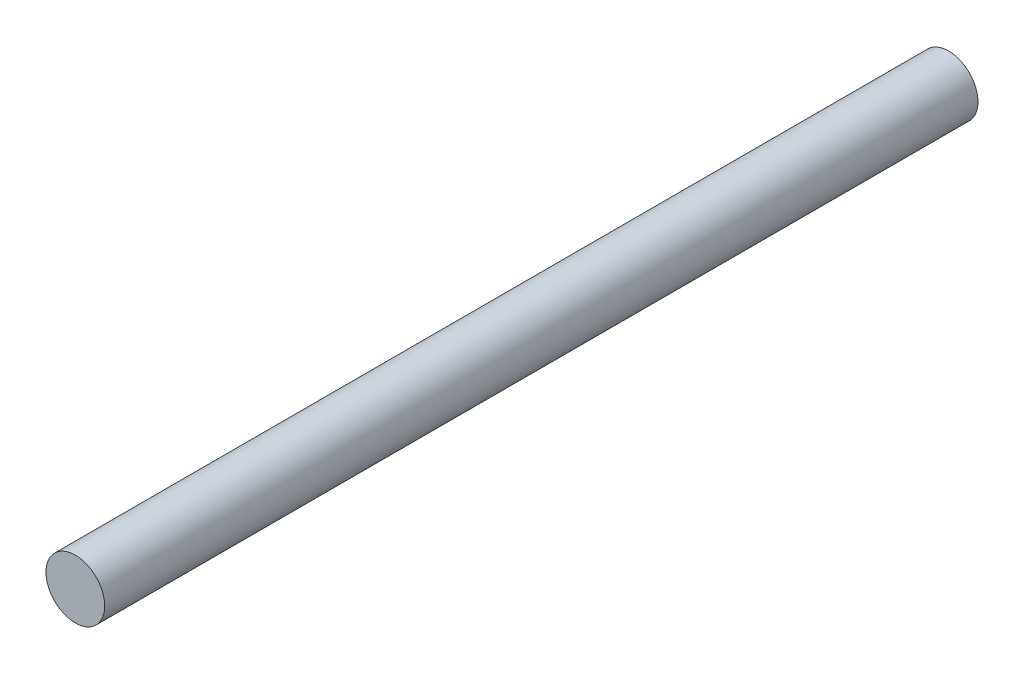
ISO-10303-21;
HEADER;
FILE_DESCRIPTION(('STEP AP214'),'2;1');
FILE_NAME('part.step','',(''),(''),'','','');
FILE_SCHEMA(('AUTOMOTIVE_DESIGN { 1 0 10303 214 1 1 1 1 }'));
ENDSEC;
DATA;
#1=APPLICATION_CONTEXT('core data for automotive mechanical design processes');
#2=APPLICATION_PROTOCOL_DEFINITION('international standard','automotive_design',2000,#1);
#3=PRODUCT_CONTEXT('',#1,'mechanical');
#4=PRODUCT('Part','Part','',(#3));
#5=PRODUCT_RELATED_PRODUCT_CATEGORY('part','',(#4));
#6=PRODUCT_DEFINITION_FORMATION('','',#4);
#7=PRODUCT_DEFINITION_CONTEXT('part definition',#1,'design');
#8=PRODUCT_DEFINITION('design','',#6,#7);
#9=PRODUCT_DEFINITION_SHAPE('','',#8);
#10=(LENGTH_UNIT() NAMED_UNIT(*) SI_UNIT(.MILLI.,.METRE.));
#11=(NAMED_UNIT(*) PLANE_ANGLE_UNIT() SI_UNIT($,.RADIAN.));
#12=(NAMED_UNIT(*) SI_UNIT($,.STERADIAN.) SOLID_ANGLE_UNIT());
#13=UNCERTAINTY_MEASURE_WITH_UNIT(LENGTH_MEASURE(1.E-05),#10,'distance_accuracy_value','');
#14=(GEOMETRIC_REPRESENTATION_CONTEXT(3) GLOBAL_UNCERTAINTY_ASSIGNED_CONTEXT((#13)) GLOBAL_UNIT_ASSIGNED_CONTEXT((#10,
#11,#12)) REPRESENTATION_CONTEXT('',''));
#15=CARTESIAN_POINT('',(0.,0.,0.));
#16=DIRECTION('',(0.,0.,1.));
#17=DIRECTION('',(1.,0.,0.));
#18=AXIS2_PLACEMENT_3D('',#15,#16,#17);
#19=CARTESIAN_POINT('',(0.,0.,330.2));
#20=DIRECTION('',(0.,0.,1.));
#21=DIRECTION('',(1.,0.,0.));
#22=AXIS2_PLACEMENT_3D('',#19,#20,#21);
#23=PLANE('',#22);
#24=CARTESIAN_POINT('',(0.,0.,330.2));
#25=DIRECTION('',(0.,0.,1.));
#26=DIRECTION('',(1.,0.,0.));
#27=AXIS2_PLACEMENT_3D('',#24,#25,#26);
#28=CIRCLE('',#27,11.1125);
#29=CARTESIAN_POINT('',(11.1125,0.,330.2));
#30=VERTEX_POINT('',#29);
#31=EDGE_CURVE('E18',#30,#30,#28,.F.);
#32=ORIENTED_EDGE('',*,*,#31,.F.);
#33=EDGE_LOOP('',(#32));
#34=FACE_BOUND('',#33,.T.);
#35=ADVANCED_FACE('F15',(#34),#23,.T.);
#36=CARTESIAN_POINT('',(0.,0.,0.));
#37=DIRECTION('',(0.,0.,1.));
#38=DIRECTION('',(1.,0.,0.));
#39=AXIS2_PLACEMENT_3D('',#36,#37,#38);
#40=PLANE('',#39);
#41=CARTESIAN_POINT('',(0.,0.,0.));
#42=DIRECTION('',(0.,0.,1.));
#43=DIRECTION('',(1.,0.,0.));
#44=AXIS2_PLACEMENT_3D('',#41,#42,#43);
#45=CIRCLE('',#44,11.1125);
#46=CARTESIAN_POINT('',(11.1125,0.,0.));
#47=VERTEX_POINT('',#46);
#48=EDGE_CURVE('E10',#47,#47,#45,.T.);
#49=ORIENTED_EDGE('',*,*,#48,.F.);
#50=EDGE_LOOP('',(#49));
#51=FACE_BOUND('',#50,.T.);
#52=ADVANCED_FACE('F30',(#51),#40,.F.);
#53=CARTESIAN_POINT('',(0.,0.,0.));
#54=DIRECTION('',(0.,0.,1.));
#55=DIRECTION('',(1.,0.,0.));
#56=AXIS2_PLACEMENT_3D('',#53,#54,#55);
#57=CYLINDRICAL_SURFACE('',#56,11.1125);
#58=ORIENTED_EDGE('',*,*,#48,.T.);
#59=EDGE_LOOP('',(#58));
#60=FACE_BOUND('',#59,.T.);
#61=ORIENTED_EDGE('',*,*,#31,.T.);
#62=EDGE_LOOP('',(#61));
#63=FACE_BOUND('',#62,.T.);
#64=ADVANCED_FACE('F27',(#60,#63),#57,.T.);
#65=CLOSED_SHELL('',(#35,#52,#64));
#66=MANIFOLD_SOLID_BREP('B1',#65);
#67=ADVANCED_BREP_SHAPE_REPRESENTATION('',(#18,#66),#14);
#68=SHAPE_DEFINITION_REPRESENTATION(#9,#67);
ENDSEC;
END-ISO-10303-21;
